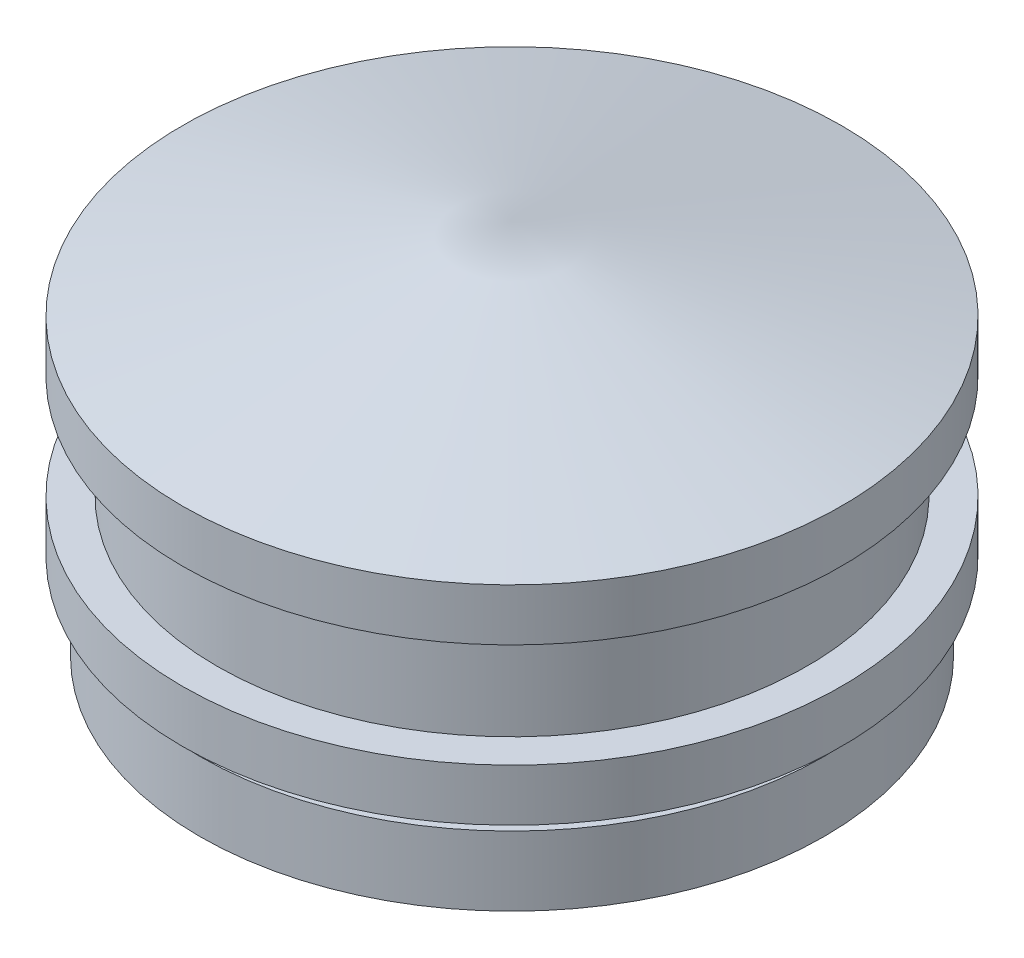
ISO-10303-21;
HEADER;
FILE_DESCRIPTION(('STEP AP214'),'2;1');
FILE_NAME('part.step','',(''),(''),'','','');
FILE_SCHEMA(('AUTOMOTIVE_DESIGN { 1 0 10303 214 1 1 1 1 }'));
ENDSEC;
DATA;
#1=APPLICATION_CONTEXT('core data for automotive mechanical design processes');
#2=APPLICATION_PROTOCOL_DEFINITION('international standard','automotive_design',2000,#1);
#3=PRODUCT_CONTEXT('',#1,'mechanical');
#4=PRODUCT('Part','Part','',(#3));
#5=PRODUCT_RELATED_PRODUCT_CATEGORY('part','',(#4));
#6=PRODUCT_DEFINITION_FORMATION('','',#4);
#7=PRODUCT_DEFINITION_CONTEXT('part definition',#1,'design');
#8=PRODUCT_DEFINITION('design','',#6,#7);
#9=PRODUCT_DEFINITION_SHAPE('','',#8);
#10=(LENGTH_UNIT() NAMED_UNIT(*) SI_UNIT(.MILLI.,.METRE.));
#11=(NAMED_UNIT(*) PLANE_ANGLE_UNIT() SI_UNIT($,.RADIAN.));
#12=(NAMED_UNIT(*) SI_UNIT($,.STERADIAN.) SOLID_ANGLE_UNIT());
#13=UNCERTAINTY_MEASURE_WITH_UNIT(LENGTH_MEASURE(1.E-05),#10,'distance_accuracy_value','');
#14=(GEOMETRIC_REPRESENTATION_CONTEXT(3) GLOBAL_UNCERTAINTY_ASSIGNED_CONTEXT((#13)) GLOBAL_UNIT_ASSIGNED_CONTEXT((#10,
#11,#12)) REPRESENTATION_CONTEXT('',''));
#15=CARTESIAN_POINT('',(0.,0.,0.));
#16=DIRECTION('',(0.,0.,1.));
#17=DIRECTION('',(1.,0.,0.));
#18=AXIS2_PLACEMENT_3D('',#15,#16,#17);
#19=CARTESIAN_POINT('',(0.,-2.36861602701019,0.));
#20=DIRECTION('',(0.,-1.,0.));
#21=DIRECTION('',(0.,0.,-1.));
#22=AXIS2_PLACEMENT_3D('',#19,#20,#21);
#23=CONICAL_SURFACE('',#22,9.5,1.32645023151569);
#24=CARTESIAN_POINT('',(0.,0.,0.));
#25=VERTEX_POINT('',#24);
#26=VERTEX_LOOP('',#25);
#27=FACE_BOUND('',#26,.T.);
#28=CARTESIAN_POINT('',(0.,-2.36861602701019,0.));
#29=DIRECTION('',(0.,1.,0.));
#30=DIRECTION('',(0.,0.,1.));
#31=AXIS2_PLACEMENT_3D('',#28,#29,#30);
#32=CIRCLE('',#31,9.5);
#33=CARTESIAN_POINT('',(0.,-2.36861602701019,9.5));
#34=VERTEX_POINT('',#33);
#35=EDGE_CURVE('E11',#34,#34,#32,.T.);
#36=ORIENTED_EDGE('',*,*,#35,.T.);
#37=EDGE_LOOP('',(#36));
#38=FACE_BOUND('',#37,.T.);
#39=ADVANCED_FACE('F39',(#27,#38),#23,.T.);
#40=CARTESIAN_POINT('',(0.,0.,0.));
#41=DIRECTION('',(0.,1.,0.));
#42=DIRECTION('',(0.,0.,1.));
#43=AXIS2_PLACEMENT_3D('',#40,#41,#42);
#44=CYLINDRICAL_SURFACE('',#43,9.5);
#45=ORIENTED_EDGE('',*,*,#35,.F.);
#46=EDGE_LOOP('',(#45));
#47=FACE_BOUND('',#46,.T.);
#48=CARTESIAN_POINT('',(0.,-3.86861602701019,0.));
#49=DIRECTION('',(0.,1.,0.));
#50=DIRECTION('',(0.,0.,1.));
#51=AXIS2_PLACEMENT_3D('',#48,#49,#50);
#52=CIRCLE('',#51,9.5);
#53=CARTESIAN_POINT('',(0.,-3.86861602701019,9.5));
#54=VERTEX_POINT('',#53);
#55=EDGE_CURVE('E46',#54,#54,#52,.T.);
#56=ORIENTED_EDGE('',*,*,#55,.T.);
#57=EDGE_LOOP('',(#56));
#58=FACE_BOUND('',#57,.T.);
#59=ADVANCED_FACE('F51',(#47,#58),#44,.T.);
#60=CARTESIAN_POINT('',(9.5,-3.86861602701019,0.));
#61=DIRECTION('',(0.,1.,0.));
#62=DIRECTION('',(0.,0.,1.));
#63=AXIS2_PLACEMENT_3D('',#60,#61,#62);
#64=PLANE('',#63);
#65=ORIENTED_EDGE('',*,*,#55,.F.);
#66=EDGE_LOOP('',(#65));
#67=FACE_BOUND('',#66,.T.);
#68=CARTESIAN_POINT('',(0.,-3.86861602701019,0.));
#69=DIRECTION('',(0.,1.,0.));
#70=DIRECTION('',(0.,0.,1.));
#71=AXIS2_PLACEMENT_3D('',#68,#69,#70);
#72=CIRCLE('',#71,8.5);
#73=CARTESIAN_POINT('',(0.,-3.86861602701019,8.5));
#74=VERTEX_POINT('',#73);
#75=EDGE_CURVE('E61',#74,#74,#72,.T.);
#76=ORIENTED_EDGE('',*,*,#75,.T.);
#77=EDGE_LOOP('',(#76));
#78=FACE_BOUND('',#77,.T.);
#79=ADVANCED_FACE('F56',(#67,#78),#64,.F.);
#80=CARTESIAN_POINT('',(0.,0.,0.));
#81=DIRECTION('',(0.,1.,0.));
#82=DIRECTION('',(0.,0.,1.));
#83=AXIS2_PLACEMENT_3D('',#80,#81,#82);
#84=CYLINDRICAL_SURFACE('',#83,8.5);
#85=ORIENTED_EDGE('',*,*,#75,.F.);
#86=EDGE_LOOP('',(#85));
#87=FACE_BOUND('',#86,.T.);
#88=CARTESIAN_POINT('',(0.,-6.86861602701018,0.));
#89=DIRECTION('',(0.,1.,0.));
#90=DIRECTION('',(0.,0.,1.));
#91=AXIS2_PLACEMENT_3D('',#88,#89,#90);
#92=CIRCLE('',#91,8.5);
#93=CARTESIAN_POINT('',(0.,-6.86861602701018,8.5));
#94=VERTEX_POINT('',#93);
#95=EDGE_CURVE('E64',#94,#94,#92,.T.);
#96=ORIENTED_EDGE('',*,*,#95,.T.);
#97=EDGE_LOOP('',(#96));
#98=FACE_BOUND('',#97,.T.);
#99=ADVANCED_FACE('F125',(#87,#98),#84,.T.);
#100=CARTESIAN_POINT('',(8.5,-6.86861602701018,0.));
#101=DIRECTION('',(0.,-1.,0.));
#102=DIRECTION('',(0.,0.,-1.));
#103=AXIS2_PLACEMENT_3D('',#100,#101,#102);
#104=PLANE('',#103);
#105=ORIENTED_EDGE('',*,*,#95,.F.);
#106=EDGE_LOOP('',(#105));
#107=FACE_BOUND('',#106,.T.);
#108=CARTESIAN_POINT('',(0.,-6.86861602701018,0.));
#109=DIRECTION('',(0.,1.,0.));
#110=DIRECTION('',(0.,0.,1.));
#111=AXIS2_PLACEMENT_3D('',#108,#109,#110);
#112=CIRCLE('',#111,9.5);
#113=CARTESIAN_POINT('',(0.,-6.86861602701018,9.5));
#114=VERTEX_POINT('',#113);
#115=EDGE_CURVE('E70',#114,#114,#112,.T.);
#116=ORIENTED_EDGE('',*,*,#115,.T.);
#117=EDGE_LOOP('',(#116));
#118=FACE_BOUND('',#117,.T.);
#119=ADVANCED_FACE('F121',(#107,#118),#104,.F.);
#120=CARTESIAN_POINT('',(0.,0.,0.));
#121=DIRECTION('',(0.,1.,0.));
#122=DIRECTION('',(0.,0.,1.));
#123=AXIS2_PLACEMENT_3D('',#120,#121,#122);
#124=CYLINDRICAL_SURFACE('',#123,9.5);
#125=ORIENTED_EDGE('',*,*,#115,.F.);
#126=EDGE_LOOP('',(#125));
#127=FACE_BOUND('',#126,.T.);
#128=CARTESIAN_POINT('',(0.,-8.36861602701019,0.));
#129=DIRECTION('',(0.,1.,0.));
#130=DIRECTION('',(0.,0.,1.));
#131=AXIS2_PLACEMENT_3D('',#128,#129,#130);
#132=CIRCLE('',#131,9.5);
#133=CARTESIAN_POINT('',(0.,-8.36861602701019,9.5));
#134=VERTEX_POINT('',#133);
#135=EDGE_CURVE('E74',#134,#134,#132,.T.);
#136=ORIENTED_EDGE('',*,*,#135,.T.);
#137=EDGE_LOOP('',(#136));
#138=FACE_BOUND('',#137,.T.);
#139=ADVANCED_FACE('F117',(#127,#138),#124,.T.);
#140=CARTESIAN_POINT('',(9.5,-8.36861602701019,0.));
#141=DIRECTION('',(0.,1.,0.));
#142=DIRECTION('',(0.,0.,1.));
#143=AXIS2_PLACEMENT_3D('',#140,#141,#142);
#144=PLANE('',#143);
#145=ORIENTED_EDGE('',*,*,#135,.F.);
#146=EDGE_LOOP('',(#145));
#147=FACE_BOUND('',#146,.T.);
#148=CARTESIAN_POINT('',(0.,-8.36861602701019,0.));
#149=DIRECTION('',(0.,1.,0.));
#150=DIRECTION('',(0.,0.,1.));
#151=AXIS2_PLACEMENT_3D('',#148,#149,#150);
#152=CIRCLE('',#151,8.5);
#153=CARTESIAN_POINT('',(0.,-8.36861602701019,8.5));
#154=VERTEX_POINT('',#153);
#155=EDGE_CURVE('E78',#154,#154,#152,.T.);
#156=ORIENTED_EDGE('',*,*,#155,.T.);
#157=EDGE_LOOP('',(#156));
#158=FACE_BOUND('',#157,.T.);
#159=ADVANCED_FACE('F113',(#147,#158),#144,.F.);
#160=CARTESIAN_POINT('',(0.,0.,0.));
#161=DIRECTION('',(0.,1.,0.));
#162=DIRECTION('',(0.,0.,1.));
#163=AXIS2_PLACEMENT_3D('',#160,#161,#162);
#164=CYLINDRICAL_SURFACE('',#163,8.5);
#165=ORIENTED_EDGE('',*,*,#155,.F.);
#166=EDGE_LOOP('',(#165));
#167=FACE_BOUND('',#166,.T.);
#168=CARTESIAN_POINT('',(0.,-8.86861602701019,0.));
#169=DIRECTION('',(0.,1.,0.));
#170=DIRECTION('',(0.,0.,1.));
#171=AXIS2_PLACEMENT_3D('',#168,#169,#170);
#172=CIRCLE('',#171,8.5);
#173=CARTESIAN_POINT('',(0.,-8.86861602701019,8.5));
#174=VERTEX_POINT('',#173);
#175=EDGE_CURVE('E82',#174,#174,#172,.T.);
#176=ORIENTED_EDGE('',*,*,#175,.T.);
#177=EDGE_LOOP('',(#176));
#178=FACE_BOUND('',#177,.T.);
#179=ADVANCED_FACE('F109',(#167,#178),#164,.T.);
#180=CARTESIAN_POINT('',(8.5,-8.86861602701019,0.));
#181=DIRECTION('',(0.,-1.,0.));
#182=DIRECTION('',(0.,0.,-1.));
#183=AXIS2_PLACEMENT_3D('',#180,#181,#182);
#184=PLANE('',#183);
#185=ORIENTED_EDGE('',*,*,#175,.F.);
#186=EDGE_LOOP('',(#185));
#187=FACE_BOUND('',#186,.T.);
#188=CARTESIAN_POINT('',(0.,-8.86861602701019,0.));
#189=DIRECTION('',(0.,1.,0.));
#190=DIRECTION('',(0.,0.,1.));
#191=AXIS2_PLACEMENT_3D('',#188,#189,#190);
#192=CIRCLE('',#191,9.);
#193=CARTESIAN_POINT('',(0.,-8.86861602701019,9.));
#194=VERTEX_POINT('',#193);
#195=EDGE_CURVE('E86',#194,#194,#192,.T.);
#196=ORIENTED_EDGE('',*,*,#195,.T.);
#197=EDGE_LOOP('',(#196));
#198=FACE_BOUND('',#197,.T.);
#199=ADVANCED_FACE('F103',(#187,#198),#184,.F.);
#200=CARTESIAN_POINT('',(0.,0.,0.));
#201=DIRECTION('',(0.,1.,0.));
#202=DIRECTION('',(0.,0.,1.));
#203=AXIS2_PLACEMENT_3D('',#200,#201,#202);
#204=CYLINDRICAL_SURFACE('',#203,9.);
#205=ORIENTED_EDGE('',*,*,#195,.F.);
#206=EDGE_LOOP('',(#205));
#207=FACE_BOUND('',#206,.T.);
#208=CARTESIAN_POINT('',(0.,-10.8686160270102,0.));
#209=DIRECTION('',(0.,1.,0.));
#210=DIRECTION('',(0.,0.,1.));
#211=AXIS2_PLACEMENT_3D('',#208,#209,#210);
#212=CIRCLE('',#211,9.);
#213=CARTESIAN_POINT('',(0.,-10.8686160270102,9.));
#214=VERTEX_POINT('',#213);
#215=EDGE_CURVE('E90',#214,#214,#212,.T.);
#216=ORIENTED_EDGE('',*,*,#215,.T.);
#217=EDGE_LOOP('',(#216));
#218=FACE_BOUND('',#217,.T.);
#219=ADVANCED_FACE('F95',(#207,#218),#204,.T.);
#220=CARTESIAN_POINT('',(9.,-10.8686160270102,0.));
#221=DIRECTION('',(0.,1.,0.));
#222=DIRECTION('',(0.,0.,1.));
#223=AXIS2_PLACEMENT_3D('',#220,#221,#222);
#224=PLANE('',#223);
#225=ORIENTED_EDGE('',*,*,#215,.F.);
#226=EDGE_LOOP('',(#225));
#227=FACE_BOUND('',#226,.T.);
#228=ADVANCED_FACE('F97',(#227),#224,.F.);
#229=CLOSED_SHELL('',(#39,#59,#79,#99,#119,#139,#159,#179,#199,#219,#228));
#230=MANIFOLD_SOLID_BREP('B2',#229);
#231=ADVANCED_BREP_SHAPE_REPRESENTATION('',(#18,#230),#14);
#232=SHAPE_DEFINITION_REPRESENTATION(#9,#231);
ENDSEC;
END-ISO-10303-21;
